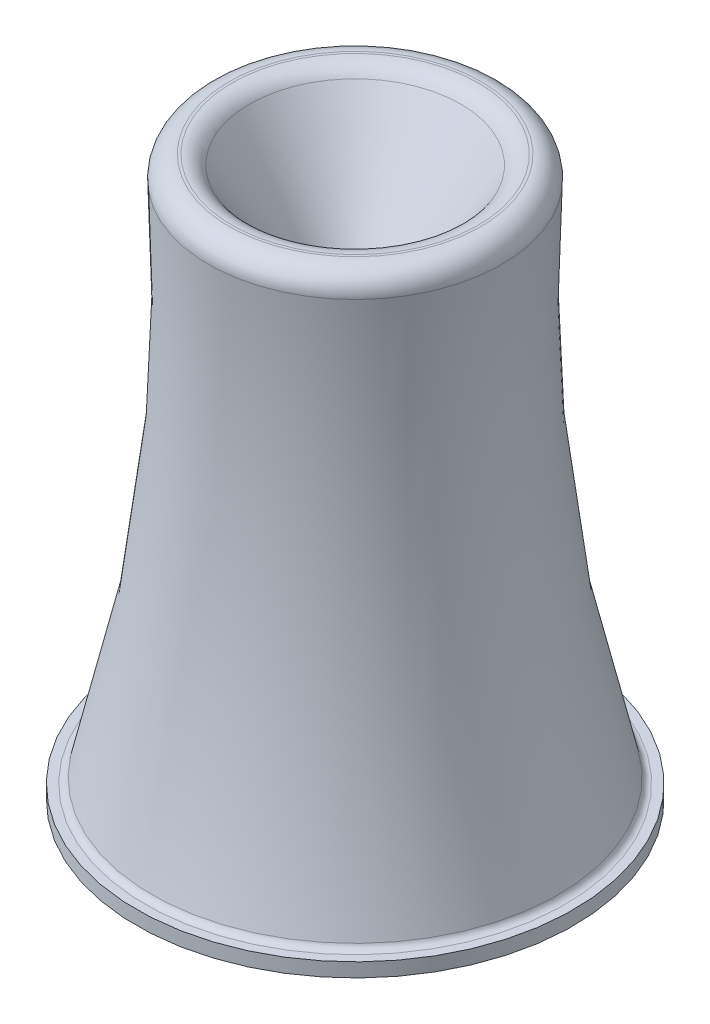
ISO-10303-21;
HEADER;
FILE_DESCRIPTION(('STEP AP214'),'2;1');
FILE_NAME('part.step','',(''),(''),'','','');
FILE_SCHEMA(('AUTOMOTIVE_DESIGN { 1 0 10303 214 1 1 1 1 }'));
ENDSEC;
DATA;
#1=APPLICATION_CONTEXT('core data for automotive mechanical design processes');
#2=APPLICATION_PROTOCOL_DEFINITION('international standard','automotive_design',2000,#1);
#3=PRODUCT_CONTEXT('',#1,'mechanical');
#4=PRODUCT('Part','Part','',(#3));
#5=PRODUCT_RELATED_PRODUCT_CATEGORY('part','',(#4));
#6=PRODUCT_DEFINITION_FORMATION('','',#4);
#7=PRODUCT_DEFINITION_CONTEXT('part definition',#1,'design');
#8=PRODUCT_DEFINITION('design','',#6,#7);
#9=PRODUCT_DEFINITION_SHAPE('','',#8);
#10=(LENGTH_UNIT() NAMED_UNIT(*) SI_UNIT(.MILLI.,.METRE.));
#11=(NAMED_UNIT(*) PLANE_ANGLE_UNIT() SI_UNIT($,.RADIAN.));
#12=(NAMED_UNIT(*) SI_UNIT($,.STERADIAN.) SOLID_ANGLE_UNIT());
#13=UNCERTAINTY_MEASURE_WITH_UNIT(LENGTH_MEASURE(1.E-05),#10,'distance_accuracy_value','');
#14=(GEOMETRIC_REPRESENTATION_CONTEXT(3) GLOBAL_UNCERTAINTY_ASSIGNED_CONTEXT((#13)) GLOBAL_UNIT_ASSIGNED_CONTEXT((#10,
#11,#12)) REPRESENTATION_CONTEXT('',''));
#15=CARTESIAN_POINT('',(0.,0.,0.));
#16=DIRECTION('',(0.,0.,1.));
#17=DIRECTION('',(1.,0.,0.));
#18=AXIS2_PLACEMENT_3D('',#15,#16,#17);
#19=CARTESIAN_POINT('',(0.,60.,-3.));
#20=DIRECTION('',(0.,-1.,0.));
#21=DIRECTION('',(0.,0.,-1.));
#22=AXIS2_PLACEMENT_3D('',#19,#20,#21);
#23=PLANE('',#22);
#24=CARTESIAN_POINT('',(0.,60.,0.));
#25=DIRECTION('',(0.,-1.,0.));
#26=DIRECTION('',(0.,0.,-1.));
#27=AXIS2_PLACEMENT_3D('',#24,#25,#26);
#28=CIRCLE('',#27,4.78902906628148);
#29=CARTESIAN_POINT('',(0.,60.,4.78902906628148));
#30=VERTEX_POINT('',#29);
#31=EDGE_CURVE('E79',#30,#30,#28,.T.);
#32=ORIENTED_EDGE('',*,*,#31,.T.);
#33=EDGE_LOOP('',(#32));
#34=FACE_BOUND('',#33,.T.);
#35=CARTESIAN_POINT('',(0.,60.,0.));
#36=DIRECTION('',(0.,-1.,0.));
#37=DIRECTION('',(0.,0.,-1.));
#38=AXIS2_PLACEMENT_3D('',#35,#36,#37);
#39=CIRCLE('',#38,3.);
#40=CARTESIAN_POINT('',(0.,60.,3.));
#41=VERTEX_POINT('',#40);
#42=EDGE_CURVE('E10',#41,#41,#39,.T.);
#43=ORIENTED_EDGE('',*,*,#42,.F.);
#44=EDGE_LOOP('',(#43));
#45=FACE_BOUND('',#44,.T.);
#46=ADVANCED_FACE('F30',(#34,#45),#23,.T.);
#47=CARTESIAN_POINT('',(0.,78.6349650517862,0.));
#48=DIRECTION('',(0.,1.,0.));
#49=DIRECTION('',(0.,0.,1.));
#50=AXIS2_PLACEMENT_3D('',#47,#48,#49);
#51=CONICAL_SURFACE('',#50,15.1127272836611,0.576375220591184);
#52=CARTESIAN_POINT('',(0.,78.6349650517862,0.));
#53=DIRECTION('',(0.,-1.,0.));
#54=DIRECTION('',(0.,0.,-1.));
#55=AXIS2_PLACEMENT_3D('',#52,#53,#54);
#56=CIRCLE('',#55,15.1127272836611);
#57=CARTESIAN_POINT('',(0.,78.6349650517863,15.1127272836611));
#58=VERTEX_POINT('',#57);
#59=EDGE_CURVE('E36',#58,#58,#56,.T.);
#60=CARTESIAN_POINT('',(0.,60.,3.));
#61=CARTESIAN_POINT('',(0.,60.1941142192894,3.12617424253814));
#62=CARTESIAN_POINT('',(0.,60.3882284385789,3.25234848507628));
#63=CARTESIAN_POINT('',(0.,60.7764568771578,3.50469697015255));
#64=CARTESIAN_POINT('',(0.,60.9705710964472,3.63087121269069));
#65=CARTESIAN_POINT('',(0.,61.3587995350261,3.88321969776696));
#66=CARTESIAN_POINT('',(0.,61.5529137543155,4.00939394030509));
#67=CARTESIAN_POINT('',(0.,61.9411421928944,4.26174242538136));
#68=CARTESIAN_POINT('',(0.,62.1352564121838,4.3879166679195));
#69=CARTESIAN_POINT('',(0.,62.5234848507627,4.64026515299578));
#70=CARTESIAN_POINT('',(0.,62.7175990700522,4.76643939553391));
#71=CARTESIAN_POINT('',(0.,63.1058275086311,5.01878788061018));
#72=CARTESIAN_POINT('',(0.,63.2999417279205,5.14496212314832));
#73=CARTESIAN_POINT('',(0.,63.6881701664994,5.39731060822459));
#74=CARTESIAN_POINT('',(0.,63.8822843857888,5.52348485076273));
#75=CARTESIAN_POINT('',(0.,64.2705128243677,5.775833335839));
#76=CARTESIAN_POINT('',(0.,64.4646270436571,5.90200757837713));
#77=CARTESIAN_POINT('',(0.,64.852855482236,6.15435606345341));
#78=CARTESIAN_POINT('',(0.,65.0469697015254,6.28053030599154));
#79=CARTESIAN_POINT('',(0.,65.4351981401043,6.53287879106782));
#80=CARTESIAN_POINT('',(0.,65.6293123593938,6.65905303360595));
#81=CARTESIAN_POINT('',(0.,66.0175407979726,6.91140151868223));
#82=CARTESIAN_POINT('',(0.,66.2116550172621,7.03757576122036));
#83=CARTESIAN_POINT('',(0.,66.599883455841,7.28992424629663));
#84=CARTESIAN_POINT('',(0.,66.7939976751304,7.41609848883477));
#85=CARTESIAN_POINT('',(0.,67.1822261137093,7.66844697391104));
#86=CARTESIAN_POINT('',(0.,67.3763403329987,7.79462121644918));
#87=CARTESIAN_POINT('',(0.,67.7645687715776,8.04696970152545));
#88=CARTESIAN_POINT('',(0.,67.958682990867,8.17314394406359));
#89=CARTESIAN_POINT('',(0.,68.3469114294459,8.42549242913986));
#90=CARTESIAN_POINT('',(0.,68.5410256487354,8.551666671678));
#91=CARTESIAN_POINT('',(0.,68.9292540873142,8.80401515675427));
#92=CARTESIAN_POINT('',(0.,69.1233683066037,8.93018939929241));
#93=CARTESIAN_POINT('',(0.,69.5115967451826,9.18253788436868));
#94=CARTESIAN_POINT('',(0.,69.705710964472,9.30871212690681));
#95=CARTESIAN_POINT('',(0.,70.0939394030509,9.56106061198309));
#96=CARTESIAN_POINT('',(0.,70.2880536223403,9.68723485452122));
#97=CARTESIAN_POINT('',(0.,70.6762820609192,9.9395833395975));
#98=CARTESIAN_POINT('',(0.,70.8703962802087,10.0657575821356));
#99=CARTESIAN_POINT('',(0.,71.2586247187875,10.3181060672119));
#100=CARTESIAN_POINT('',(0.,71.452738938077,10.44428030975));
#101=CARTESIAN_POINT('',(0.,71.8409673766559,10.6966287948263));
#102=CARTESIAN_POINT('',(0.,72.0350815959453,10.8228030373645));
#103=CARTESIAN_POINT('',(0.,72.4233100345242,11.0751515224407));
#104=CARTESIAN_POINT('',(0.,72.6174242538136,11.2013257649789));
#105=CARTESIAN_POINT('',(0.,73.0056526923925,11.4536742500551));
#106=CARTESIAN_POINT('',(0.,73.1997669116819,11.5798484925933));
#107=CARTESIAN_POINT('',(0.,73.5879953502608,11.8321969776695));
#108=CARTESIAN_POINT('',(0.,73.7821095695503,11.9583712202077));
#109=CARTESIAN_POINT('',(0.,74.1703380081291,12.2107197052839));
#110=CARTESIAN_POINT('',(0.,74.3644522274186,12.3368939478221));
#111=CARTESIAN_POINT('',(0.,74.7526806659975,12.5892424328984));
#112=CARTESIAN_POINT('',(0.,74.9467948852869,12.7154166754365));
#113=CARTESIAN_POINT('',(0.,75.3350233238658,12.9677651605128));
#114=CARTESIAN_POINT('',(0.,75.5291375431552,13.0939394030509));
#115=CARTESIAN_POINT('',(0.,75.9173659817341,13.3462878881272));
#116=CARTESIAN_POINT('',(0.,76.1114802010235,13.4724621306653));
#117=CARTESIAN_POINT('',(0.,76.4997086396024,13.7248106157416));
#118=CARTESIAN_POINT('',(0.,76.6938228588918,13.8509848582797));
#119=CARTESIAN_POINT('',(0.,77.0820512974707,14.103333343356));
#120=CARTESIAN_POINT('',(0.,77.2761655167602,14.2295075858941));
#121=CARTESIAN_POINT('',(0.,77.6643939553391,14.4818560709704));
#122=CARTESIAN_POINT('',(0.,77.8585081746285,14.6080303135085));
#123=CARTESIAN_POINT('',(0.,78.2467366132074,14.8603787985848));
#124=CARTESIAN_POINT('',(0.,78.4408508324968,14.9865530411229));
#125=CARTESIAN_POINT('',(0.,78.6349650517862,15.1127272836611));
#126=B_SPLINE_CURVE_WITH_KNOTS('',3,(#60,#61,#62,#63,#64,#65,#66,#67,#68,#69,#70,#71,#72,#73,
#74,#75,#76,#77,#78,#79,#80,#81,#82,#83,#84,#85,#86,#87,#88,#89,#90,#91,#92,#93,#94,#95,#96,#97,
#98,#99,#100,#101,#102,#103,#104,#105,#106,#107,#108,#109,#110,#111,#112,#113,#114,#115,#116,
#117,#118,#119,#120,#121,#122,#123,#124,#125),.UNSPECIFIED.,.F.,.F.,(4,2,2,2,2,2,2,2,2,2,2,2,2,
2,2,2,2,2,2,2,2,2,2,2,2,2,2,2,2,2,2,2,4),(0.,0.694551960974695,1.38910392194938,
2.08365588292408,2.77820784389877,3.47275980487347,4.16731176584816,4.86186372682285,
5.55641568779755,6.25096764877224,6.94551960974693,7.64007157072163,8.33462353169631,
9.029175492671,9.7237274536457,10.4182794146204,11.1128313755951,11.8073833365698,
12.5019352975445,13.1964872585192,13.8910392194939,14.5855911804685,15.2801431414432,
15.9746951024179,16.6692470633926,17.3637990243673,18.058350985342,18.7529029463167,
19.4474549072914,20.1420068682661,20.8365588292408,21.5311107902155,22.2256627511902),.UNSPECIFIED.);
#127=EDGE_CURVE('BSEAM97',#41,#58,#126,.T.);
#128=ORIENTED_EDGE('',*,*,#42,.T.);
#129=ORIENTED_EDGE('',*,*,#59,.F.);
#130=ORIENTED_EDGE('',*,*,#127,.T.);
#131=ORIENTED_EDGE('',*,*,#127,.F.);
#132=EDGE_LOOP('',(#128,#130,#129,#131));
#133=FACE_BOUND('',#132,.T.);
#134=ADVANCED_FACE('F97',(#133),#51,.F.);
#135=CARTESIAN_POINT('',(0.,77.,0.));
#136=DIRECTION('',(0.,-1.,0.));
#137=DIRECTION('',(0.,0.,-1.));
#138=AXIS2_PLACEMENT_3D('',#135,#136,#137);
#139=TOROIDAL_SURFACE('',#138,17.628058132563,3.);
#140=ORIENTED_EDGE('',*,*,#59,.T.);
#141=EDGE_LOOP('',(#140));
#142=FACE_BOUND('',#141,.T.);
#143=CARTESIAN_POINT('',(0.,80.,0.));
#144=DIRECTION('',(0.,-1.,0.));
#145=DIRECTION('',(0.,0.,-1.));
#146=AXIS2_PLACEMENT_3D('',#143,#144,#145);
#147=CIRCLE('',#146,17.628058132563);
#148=CARTESIAN_POINT('',(0.,80.,-17.628058132563));
#149=VERTEX_POINT('',#148);
#150=EDGE_CURVE('E40',#149,#149,#147,.T.);
#151=ORIENTED_EDGE('',*,*,#150,.F.);
#152=EDGE_LOOP('',(#151));
#153=FACE_BOUND('',#152,.T.);
#154=ADVANCED_FACE('F101',(#142,#153),#139,.T.);
#155=CARTESIAN_POINT('',(0.,80.,-17.628058132563));
#156=DIRECTION('',(0.,1.,0.));
#157=DIRECTION('',(0.,0.,1.));
#158=AXIS2_PLACEMENT_3D('',#155,#156,#157);
#159=PLANE('',#158);
#160=ORIENTED_EDGE('',*,*,#150,.T.);
#161=EDGE_LOOP('',(#160));
#162=FACE_BOUND('',#161,.T.);
#163=CARTESIAN_POINT('',(0.,80.,0.));
#164=DIRECTION('',(0.,-1.,0.));
#165=DIRECTION('',(0.,0.,-1.));
#166=AXIS2_PLACEMENT_3D('',#163,#164,#165);
#167=CIRCLE('',#166,18.);
#168=CARTESIAN_POINT('',(0.,80.,-18.));
#169=VERTEX_POINT('',#168);
#170=EDGE_CURVE('E44',#169,#169,#167,.T.);
#171=ORIENTED_EDGE('',*,*,#170,.F.);
#172=EDGE_LOOP('',(#171));
#173=FACE_BOUND('',#172,.T.);
#174=ADVANCED_FACE('F105',(#162,#173),#159,.T.);
#175=CARTESIAN_POINT('',(0.,77.,0.));
#176=DIRECTION('',(0.,-1.,0.));
#177=DIRECTION('',(0.,0.,-1.));
#178=AXIS2_PLACEMENT_3D('',#175,#176,#177);
#179=TOROIDAL_SURFACE('',#178,18.,2.99999999999999);
#180=ORIENTED_EDGE('',*,*,#170,.T.);
#181=EDGE_LOOP('',(#180));
#182=FACE_BOUND('',#181,.T.);
#183=CARTESIAN_POINT('',(0.,76.8141072392825,0.));
#184=DIRECTION('',(0.,-1.,0.));
#185=DIRECTION('',(0.,0.,-1.));
#186=AXIS2_PLACEMENT_3D('',#183,#184,#185);
#187=CIRCLE('',#186,20.994235107922);
#188=CARTESIAN_POINT('',(0.,76.8141072392825,-20.994235107922));
#189=VERTEX_POINT('',#188);
#190=EDGE_CURVE('E49',#189,#189,#187,.T.);
#191=ORIENTED_EDGE('',*,*,#190,.F.);
#192=EDGE_LOOP('',(#191));
#193=FACE_BOUND('',#192,.T.);
#194=ADVANCED_FACE('F111',(#182,#193),#179,.T.);
#195=CARTESIAN_POINT('',(0.,63.1819714533305,0.));
#196=DIRECTION('',(0.,-1.,0.));
#197=DIRECTION('',(0.,0.,-1.));
#198=AXIS2_PLACEMENT_3D('',#195,#196,#197);
#199=TOROIDAL_SURFACE('',#198,240.571476355537,220.);
#200=ORIENTED_EDGE('',*,*,#190,.T.);
#201=EDGE_LOOP('',(#200));
#202=FACE_BOUND('',#201,.T.);
#203=CARTESIAN_POINT('',(0.,2.72519647738211,0.));
#204=DIRECTION('',(0.,-1.,0.));
#205=DIRECTION('',(0.,0.,-1.));
#206=AXIS2_PLACEMENT_3D('',#203,#204,#205);
#207=CIRCLE('',#206,29.0413878113598);
#208=CARTESIAN_POINT('',(0.,2.72519647738211,-29.0413878113598));
#209=VERTEX_POINT('',#208);
#210=EDGE_CURVE('E52',#209,#209,#207,.T.);
#211=ORIENTED_EDGE('',*,*,#210,.F.);
#212=EDGE_LOOP('',(#211));
#213=FACE_BOUND('',#212,.T.);
#214=ADVANCED_FACE('F115',(#202,#213),#199,.F.);
#215=CARTESIAN_POINT('',(0.,3.,0.));
#216=DIRECTION('',(0.,-1.,0.));
#217=DIRECTION('',(0.,0.,-1.));
#218=AXIS2_PLACEMENT_3D('',#215,#216,#217);
#219=TOROIDAL_SURFACE('',#218,30.0028882138333,0.999999999999985);
#220=ORIENTED_EDGE('',*,*,#210,.T.);
#221=EDGE_LOOP('',(#220));
#222=FACE_BOUND('',#221,.T.);
#223=CARTESIAN_POINT('',(0.,2.00000000000002,0.));
#224=DIRECTION('',(0.,-1.,0.));
#225=DIRECTION('',(0.,0.,-1.));
#226=AXIS2_PLACEMENT_3D('',#223,#224,#225);
#227=CIRCLE('',#226,30.0028882138333);
#228=CARTESIAN_POINT('',(0.,2.00000000000002,-30.0028882138333));
#229=VERTEX_POINT('',#228);
#230=EDGE_CURVE('E55',#229,#229,#227,.T.);
#231=ORIENTED_EDGE('',*,*,#230,.F.);
#232=EDGE_LOOP('',(#231));
#233=FACE_BOUND('',#232,.T.);
#234=ADVANCED_FACE('F119',(#222,#233),#219,.F.);
#235=CARTESIAN_POINT('',(0.,2.00000000000001,-31.25));
#236=DIRECTION('',(0.,1.,0.));
#237=DIRECTION('',(0.,0.,1.));
#238=AXIS2_PLACEMENT_3D('',#235,#236,#237);
#239=PLANE('',#238);
#240=ORIENTED_EDGE('',*,*,#230,.T.);
#241=EDGE_LOOP('',(#240));
#242=FACE_BOUND('',#241,.T.);
#243=CARTESIAN_POINT('',(0.,2.,0.));
#244=DIRECTION('',(0.,-1.,0.));
#245=DIRECTION('',(0.,0.,-1.));
#246=AXIS2_PLACEMENT_3D('',#243,#244,#245);
#247=CIRCLE('',#246,31.25);
#248=CARTESIAN_POINT('',(0.,2.,-31.25));
#249=VERTEX_POINT('',#248);
#250=EDGE_CURVE('E58',#249,#249,#247,.T.);
#251=ORIENTED_EDGE('',*,*,#250,.F.);
#252=EDGE_LOOP('',(#251));
#253=FACE_BOUND('',#252,.T.);
#254=ADVANCED_FACE('F123',(#242,#253),#239,.T.);
#255=CARTESIAN_POINT('',(0.,0.,0.));
#256=DIRECTION('',(0.,-1.,0.));
#257=DIRECTION('',(0.,0.,-1.));
#258=AXIS2_PLACEMENT_3D('',#255,#256,#257);
#259=CYLINDRICAL_SURFACE('',#258,31.25);
#260=ORIENTED_EDGE('',*,*,#250,.T.);
#261=EDGE_LOOP('',(#260));
#262=FACE_BOUND('',#261,.T.);
#263=CARTESIAN_POINT('',(0.,0.,0.));
#264=DIRECTION('',(0.,-1.,0.));
#265=DIRECTION('',(0.,0.,-1.));
#266=AXIS2_PLACEMENT_3D('',#263,#264,#265);
#267=CIRCLE('',#266,31.25);
#268=CARTESIAN_POINT('',(0.,0.,-31.25));
#269=VERTEX_POINT('',#268);
#270=EDGE_CURVE('E61',#269,#269,#267,.T.);
#271=ORIENTED_EDGE('',*,*,#270,.F.);
#272=EDGE_LOOP('',(#271));
#273=FACE_BOUND('',#272,.T.);
#274=ADVANCED_FACE('F127',(#262,#273),#259,.T.);
#275=CARTESIAN_POINT('',(0.,0.,-31.25));
#276=DIRECTION('',(0.,-1.,0.));
#277=DIRECTION('',(0.,0.,-1.));
#278=AXIS2_PLACEMENT_3D('',#275,#276,#277);
#279=PLANE('',#278);
#280=ORIENTED_EDGE('',*,*,#270,.T.);
#281=EDGE_LOOP('',(#280));
#282=FACE_BOUND('',#281,.T.);
#283=CARTESIAN_POINT('',(0.,0.,0.));
#284=DIRECTION('',(0.,-1.,0.));
#285=DIRECTION('',(0.,0.,-1.));
#286=AXIS2_PLACEMENT_3D('',#283,#284,#285);
#287=CIRCLE('',#286,28.2738350985733);
#288=CARTESIAN_POINT('',(0.,0.,-28.2738350985733));
#289=VERTEX_POINT('',#288);
#290=EDGE_CURVE('E64',#289,#289,#287,.T.);
#291=ORIENTED_EDGE('',*,*,#290,.F.);
#292=EDGE_LOOP('',(#291));
#293=FACE_BOUND('',#292,.T.);
#294=ADVANCED_FACE('F131',(#282,#293),#279,.T.);
#295=CARTESIAN_POINT('',(0.,63.1819714533305,0.));
#296=DIRECTION('',(0.,-1.,0.));
#297=DIRECTION('',(0.,0.,-1.));
#298=AXIS2_PLACEMENT_3D('',#295,#296,#297);
#299=TOROIDAL_SURFACE('',#298,240.571476355537,221.5);
#300=ORIENTED_EDGE('',*,*,#290,.T.);
#301=EDGE_LOOP('',(#300));
#302=FACE_BOUND('',#301,.T.);
#303=CARTESIAN_POINT('',(0.,76.9070536196412,0.));
#304=DIRECTION('',(0.,-1.,0.));
#305=DIRECTION('',(0.,0.,-1.));
#306=AXIS2_PLACEMENT_3D('',#303,#304,#305);
#307=CIRCLE('',#306,19.4971175539611);
#308=CARTESIAN_POINT('',(0.,76.9070536196412,-19.4971175539611));
#309=VERTEX_POINT('',#308);
#310=EDGE_CURVE('E67',#309,#309,#307,.T.);
#311=ORIENTED_EDGE('',*,*,#310,.F.);
#312=EDGE_LOOP('',(#311));
#313=FACE_BOUND('',#312,.T.);
#314=ADVANCED_FACE('F135',(#302,#313),#299,.T.);
#315=CARTESIAN_POINT('',(0.,77.,0.));
#316=DIRECTION('',(0.,-1.,0.));
#317=DIRECTION('',(0.,0.,-1.));
#318=AXIS2_PLACEMENT_3D('',#315,#316,#317);
#319=TOROIDAL_SURFACE('',#318,18.,1.49999999999999);
#320=ORIENTED_EDGE('',*,*,#310,.T.);
#321=EDGE_LOOP('',(#320));
#322=FACE_BOUND('',#321,.T.);
#323=CARTESIAN_POINT('',(0.,78.5,0.));
#324=DIRECTION('',(0.,-1.,0.));
#325=DIRECTION('',(0.,0.,-1.));
#326=AXIS2_PLACEMENT_3D('',#323,#324,#325);
#327=CIRCLE('',#326,18.);
#328=CARTESIAN_POINT('',(0.,78.5,-18.));
#329=VERTEX_POINT('',#328);
#330=EDGE_CURVE('E70',#329,#329,#327,.T.);
#331=ORIENTED_EDGE('',*,*,#330,.F.);
#332=EDGE_LOOP('',(#331));
#333=FACE_BOUND('',#332,.T.);
#334=ADVANCED_FACE('F139',(#322,#333),#319,.F.);
#335=CARTESIAN_POINT('',(0.,78.5,-17.628058132563));
#336=DIRECTION('',(0.,-1.,0.));
#337=DIRECTION('',(0.,0.,-1.));
#338=AXIS2_PLACEMENT_3D('',#335,#336,#337);
#339=PLANE('',#338);
#340=ORIENTED_EDGE('',*,*,#330,.T.);
#341=EDGE_LOOP('',(#340));
#342=FACE_BOUND('',#341,.T.);
#343=CARTESIAN_POINT('',(0.,78.5,0.));
#344=DIRECTION('',(0.,-1.,0.));
#345=DIRECTION('',(0.,0.,-1.));
#346=AXIS2_PLACEMENT_3D('',#343,#344,#345);
#347=CIRCLE('',#346,17.628058132563);
#348=CARTESIAN_POINT('',(0.,78.5,-17.628058132563));
#349=VERTEX_POINT('',#348);
#350=EDGE_CURVE('E73',#349,#349,#347,.T.);
#351=ORIENTED_EDGE('',*,*,#350,.F.);
#352=EDGE_LOOP('',(#351));
#353=FACE_BOUND('',#352,.T.);
#354=ADVANCED_FACE('F93',(#342,#353),#339,.T.);
#355=CARTESIAN_POINT('',(0.,77.,0.));
#356=DIRECTION('',(0.,-1.,0.));
#357=DIRECTION('',(0.,0.,-1.));
#358=AXIS2_PLACEMENT_3D('',#355,#356,#357);
#359=TOROIDAL_SURFACE('',#358,17.628058132563,1.5);
#360=ORIENTED_EDGE('',*,*,#350,.T.);
#361=EDGE_LOOP('',(#360));
#362=FACE_BOUND('',#361,.T.);
#363=CARTESIAN_POINT('',(0.,77.8174825258931,0.));
#364=DIRECTION('',(0.,-1.,0.));
#365=DIRECTION('',(0.,0.,-1.));
#366=AXIS2_PLACEMENT_3D('',#363,#364,#365);
#367=CIRCLE('',#366,16.370392708112);
#368=CARTESIAN_POINT('',(0.,77.8174825258931,16.370392708112));
#369=VERTEX_POINT('',#368);
#370=EDGE_CURVE('E76',#369,#369,#367,.T.);
#371=ORIENTED_EDGE('',*,*,#370,.F.);
#372=EDGE_LOOP('',(#371));
#373=FACE_BOUND('',#372,.T.);
#374=ADVANCED_FACE('F87',(#362,#373),#359,.F.);
#375=CARTESIAN_POINT('',(0.,60.,0.));
#376=DIRECTION('',(0.,1.,0.));
#377=DIRECTION('',(0.,0.,1.));
#378=AXIS2_PLACEMENT_3D('',#375,#376,#377);
#379=CONICAL_SURFACE('',#378,4.78902906628148,0.576375220591184);
#380=CARTESIAN_POINT('',(0.,77.8174825258931,16.370392708112));
#381=CARTESIAN_POINT('',(0.,77.6318837495817,16.2497535035096));
#382=CARTESIAN_POINT('',(0.,77.4462849732704,16.1291142989072));
#383=CARTESIAN_POINT('',(0.,77.0750874206476,15.8878358897024));
#384=CARTESIAN_POINT('',(0.,76.8894886443362,15.7671966851));
#385=CARTESIAN_POINT('',(0.,76.5182910917134,15.5259182758952));
#386=CARTESIAN_POINT('',(0.,76.332692315402,15.4052790712928));
#387=CARTESIAN_POINT('',(0.,75.9614947627793,15.164000662088));
#388=CARTESIAN_POINT('',(0.,75.7758959864679,15.0433614574856));
#389=CARTESIAN_POINT('',(0.,75.4046984338451,14.8020830482808));
#390=CARTESIAN_POINT('',(0.,75.2190996575337,14.6814438436784));
#391=CARTESIAN_POINT('',(0.,74.8479021049109,14.4401654344736));
#392=CARTESIAN_POINT('',(0.,74.6623033285995,14.3195262298712));
#393=CARTESIAN_POINT('',(0.,74.2911057759768,14.0782478206664));
#394=CARTESIAN_POINT('',(0.,74.1055069996654,13.957608616064));
#395=CARTESIAN_POINT('',(0.,73.7343094470426,13.7163302068592));
#396=CARTESIAN_POINT('',(0.,73.5487106707312,13.5956910022568));
#397=CARTESIAN_POINT('',(0.,73.1775131181085,13.354412593052));
#398=CARTESIAN_POINT('',(0.,72.9919143417971,13.2337733884496));
#399=CARTESIAN_POINT('',(0.,72.6207167891743,12.9924949792448));
#400=CARTESIAN_POINT('',(0.,72.4351180128629,12.8718557746424));
#401=CARTESIAN_POINT('',(0.,72.0639204602401,12.6305773654376));
#402=CARTESIAN_POINT('',(0.,71.8783216839288,12.5099381608352));
#403=CARTESIAN_POINT('',(0.,71.507124131306,12.2686597516304));
#404=CARTESIAN_POINT('',(0.,71.3215253549946,12.148020547028));
#405=CARTESIAN_POINT('',(0.,70.9503278023718,11.9067421378232));
#406=CARTESIAN_POINT('',(0.,70.7647290260604,11.7861029332208));
#407=CARTESIAN_POINT('',(0.,70.3935314734377,11.544824524016));
#408=CARTESIAN_POINT('',(0.,70.2079326971263,11.4241853194136));
#409=CARTESIAN_POINT('',(0.,69.8367351445035,11.1829069102088));
#410=CARTESIAN_POINT('',(0.,69.6511363681921,11.0622677056064));
#411=CARTESIAN_POINT('',(0.,69.2799388155694,10.8209892964016));
#412=CARTESIAN_POINT('',(0.,69.0943400392579,10.7003500917992));
#413=CARTESIAN_POINT('',(0.,68.7231424866352,10.4590716825944));
#414=CARTESIAN_POINT('',(0.,68.5375437103238,10.338432477992));
#415=CARTESIAN_POINT('',(0.,68.166346157701,10.0971540687872));
#416=CARTESIAN_POINT('',(0.,67.9807473813896,9.97651486418475));
#417=CARTESIAN_POINT('',(0.,67.6095498287669,9.73523645497995));
#418=CARTESIAN_POINT('',(0.,67.4239510524555,9.61459725037755));
#419=CARTESIAN_POINT('',(0.,67.0527534998327,9.37331884117275));
#420=CARTESIAN_POINT('',(0.,66.8671547235213,9.25267963657034));
#421=CARTESIAN_POINT('',(0.,66.4959571708985,9.01140122736554));
#422=CARTESIAN_POINT('',(0.,66.3103583945872,8.89076202276314));
#423=CARTESIAN_POINT('',(0.,65.9391608419644,8.64948361355833));
#424=CARTESIAN_POINT('',(0.,65.753562065653,8.52884440895593));
#425=CARTESIAN_POINT('',(0.,65.3823645130302,8.28756599975113));
#426=CARTESIAN_POINT('',(0.,65.1967657367188,8.16692679514873));
#427=CARTESIAN_POINT('',(0.,64.8255681840961,7.92564838594392));
#428=CARTESIAN_POINT('',(0.,64.6399694077847,7.80500918134152));
#429=CARTESIAN_POINT('',(0.,64.2687718551619,7.56373077213672));
#430=CARTESIAN_POINT('',(0.,64.0831730788505,7.44309156753432));
#431=CARTESIAN_POINT('',(0.,63.7119755262277,7.20181315832952));
#432=CARTESIAN_POINT('',(0.,63.5263767499163,7.08117395372711));
#433=CARTESIAN_POINT('',(0.,63.1551791972936,6.83989554452231));
#434=CARTESIAN_POINT('',(0.,62.9695804209822,6.71925633991991));
#435=CARTESIAN_POINT('',(0.,62.5983828683594,6.47797793071511));
#436=CARTESIAN_POINT('',(0.,62.412784092048,6.3573387261127));
#437=CARTESIAN_POINT('',(0.,62.0415865394253,6.1160603169079));
#438=CARTESIAN_POINT('',(0.,61.8559877631139,5.9954211123055));
#439=CARTESIAN_POINT('',(0.,61.4847902104911,5.7541427031007));
#440=CARTESIAN_POINT('',(0.,61.2991914341797,5.6335034984983));
#441=CARTESIAN_POINT('',(0.,60.9279938815569,5.39222508929349));
#442=CARTESIAN_POINT('',(0.,60.7423951052455,5.27158588469109));
#443=CARTESIAN_POINT('',(0.,60.3711975526228,5.03030747548629));
#444=CARTESIAN_POINT('',(0.,60.1855987763114,4.90966827088389));
#445=CARTESIAN_POINT('',(0.,60.,4.78902906628148));
#446=B_SPLINE_CURVE_WITH_KNOTS('',3,(#380,#381,#382,#383,#384,#385,#386,#387,#388,#389,#390,
#391,#392,#393,#394,#395,#396,#397,#398,#399,#400,#401,#402,#403,#404,#405,#406,#407,#408,#409,
#410,#411,#412,#413,#414,#415,#416,#417,#418,#419,#420,#421,#422,#423,#424,#425,#426,#427,#428,
#429,#430,#431,#432,#433,#434,#435,#436,#437,#438,#439,#440,#441,#442,#443,#444,#445),
.UNSPECIFIED.,.F.,.F.,(4,2,2,2,2,2,2,2,2,2,2,2,2,2,2,2,2,2,2,2,2,2,2,2,2,2,2,2,2,2,2,2,4),(0.,
0.664083210974688,1.32816642194938,1.99224963292407,2.65633284389877,3.32041605487346,
3.98449926584816,4.64858247682285,5.31266568779754,5.97674889877223,6.64083210974693,
7.30491532072162,7.96899853169631,8.63308174267101,9.2971649536457,9.96124816462039,
10.6253313755951,11.2894145865698,11.9534977975445,12.6175810085192,13.2816642194939,
13.9457474304685,14.6098306414432,15.2739138524179,15.9379970633926,16.6020802743673,
17.266163485342,17.9302466963167,18.5943299072914,19.2584131182661,19.9224963292408,
20.5865795402155,21.2506627511902),.UNSPECIFIED.);
#447=EDGE_CURVE('BSEAM85',#369,#30,#446,.T.);
#448=ORIENTED_EDGE('',*,*,#370,.T.);
#449=ORIENTED_EDGE('',*,*,#31,.F.);
#450=ORIENTED_EDGE('',*,*,#447,.T.);
#451=ORIENTED_EDGE('',*,*,#447,.F.);
#452=EDGE_LOOP('',(#448,#450,#449,#451));
#453=FACE_BOUND('',#452,.T.);
#454=ADVANCED_FACE('F85',(#453),#379,.T.);
#455=CLOSED_SHELL('',(#46,#134,#154,#174,#194,#214,#234,#254,#274,#294,#314,#334,#354,#374,#454));
#456=MANIFOLD_SOLID_BREP('B2',#455);
#457=ADVANCED_BREP_SHAPE_REPRESENTATION('',(#18,#456),#14);
#458=SHAPE_DEFINITION_REPRESENTATION(#9,#457);
ENDSEC;
END-ISO-10303-21;
